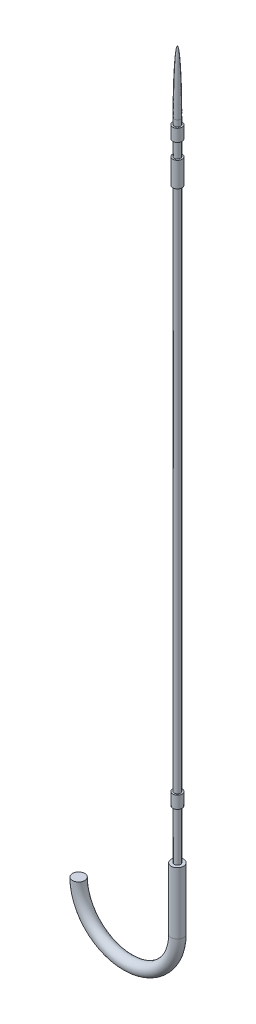
ISO-10303-21;
HEADER;
FILE_DESCRIPTION(('STEP AP214'),'2;1');
FILE_NAME('part.step','',(''),(''),'','','');
FILE_SCHEMA(('AUTOMOTIVE_DESIGN { 1 0 10303 214 1 1 1 1 }'));
ENDSEC;
DATA;
#1=APPLICATION_CONTEXT('core data for automotive mechanical design processes');
#2=APPLICATION_PROTOCOL_DEFINITION('international standard','automotive_design',2000,#1);
#3=PRODUCT_CONTEXT('',#1,'mechanical');
#4=PRODUCT('Part','Part','',(#3));
#5=PRODUCT_RELATED_PRODUCT_CATEGORY('part','',(#4));
#6=PRODUCT_DEFINITION_FORMATION('','',#4);
#7=PRODUCT_DEFINITION_CONTEXT('part definition',#1,'design');
#8=PRODUCT_DEFINITION('design','',#6,#7);
#9=PRODUCT_DEFINITION_SHAPE('','',#8);
#10=(LENGTH_UNIT() NAMED_UNIT(*) SI_UNIT(.MILLI.,.METRE.));
#11=(NAMED_UNIT(*) PLANE_ANGLE_UNIT() SI_UNIT($,.RADIAN.));
#12=(NAMED_UNIT(*) SI_UNIT($,.STERADIAN.) SOLID_ANGLE_UNIT());
#13=UNCERTAINTY_MEASURE_WITH_UNIT(LENGTH_MEASURE(1.E-05),#10,'distance_accuracy_value','');
#14=(GEOMETRIC_REPRESENTATION_CONTEXT(3) GLOBAL_UNCERTAINTY_ASSIGNED_CONTEXT((#13)) GLOBAL_UNIT_ASSIGNED_CONTEXT((#10,
#11,#12)) REPRESENTATION_CONTEXT('',''));
#15=CARTESIAN_POINT('',(0.,0.,0.));
#16=DIRECTION('',(0.,0.,1.));
#17=DIRECTION('',(1.,0.,0.));
#18=AXIS2_PLACEMENT_3D('',#15,#16,#17);
#19=CARTESIAN_POINT('',(0.,870.,0.));
#20=DIRECTION('',(0.,-1.,0.));
#21=DIRECTION('',(0.,0.,-1.));
#22=AXIS2_PLACEMENT_3D('',#19,#20,#21);
#23=CYLINDRICAL_SURFACE('',#22,5.);
#24=CARTESIAN_POINT('',(0.,0.,0.));
#25=DIRECTION('',(0.,1.,0.));
#26=DIRECTION('',(0.,0.,1.));
#27=AXIS2_PLACEMENT_3D('',#24,#25,#26);
#28=CIRCLE('',#27,5.);
#29=CARTESIAN_POINT('',(0.,0.,-5.));
#30=VERTEX_POINT('',#29);
#31=EDGE_CURVE('E76',#30,#30,#28,.T.);
#32=CARTESIAN_POINT('',(0.,850.,0.));
#33=DIRECTION('',(0.,1.,0.));
#34=DIRECTION('',(0.,0.,1.));
#35=AXIS2_PLACEMENT_3D('',#32,#33,#34);
#36=CIRCLE('',#35,5.);
#37=CARTESIAN_POINT('',(0.,850.,-5.));
#38=VERTEX_POINT('',#37);
#39=EDGE_CURVE('E75',#38,#38,#36,.T.);
#40=CARTESIAN_POINT('',(0.,0.,-5.));
#41=CARTESIAN_POINT('',(0.,8.85416666666669,-5.));
#42=CARTESIAN_POINT('',(0.,17.7083333333334,-5.));
#43=CARTESIAN_POINT('',(0.,35.4166666666667,-5.));
#44=CARTESIAN_POINT('',(0.,44.2708333333333,-5.));
#45=CARTESIAN_POINT('',(0.,61.9791666666667,-5.));
#46=CARTESIAN_POINT('',(0.,70.8333333333333,-5.));
#47=CARTESIAN_POINT('',(0.,88.5416666666667,-5.));
#48=CARTESIAN_POINT('',(0.,97.3958333333333,-5.));
#49=CARTESIAN_POINT('',(0.,115.104166666667,-5.));
#50=CARTESIAN_POINT('',(0.,123.958333333333,-5.));
#51=CARTESIAN_POINT('',(0.,141.666666666667,-5.));
#52=CARTESIAN_POINT('',(0.,150.520833333333,-5.));
#53=CARTESIAN_POINT('',(0.,168.229166666667,-5.));
#54=CARTESIAN_POINT('',(0.,177.083333333333,-5.));
#55=CARTESIAN_POINT('',(0.,194.791666666667,-5.));
#56=CARTESIAN_POINT('',(0.,203.645833333333,-5.));
#57=CARTESIAN_POINT('',(0.,221.354166666667,-5.));
#58=CARTESIAN_POINT('',(0.,230.208333333333,-5.));
#59=CARTESIAN_POINT('',(0.,247.916666666667,-5.));
#60=CARTESIAN_POINT('',(0.,256.770833333333,-5.));
#61=CARTESIAN_POINT('',(0.,274.479166666667,-5.));
#62=CARTESIAN_POINT('',(0.,283.333333333333,-5.));
#63=CARTESIAN_POINT('',(0.,301.041666666667,-5.));
#64=CARTESIAN_POINT('',(0.,309.895833333333,-5.));
#65=CARTESIAN_POINT('',(0.,327.604166666667,-5.));
#66=CARTESIAN_POINT('',(0.,336.458333333333,-5.));
#67=CARTESIAN_POINT('',(0.,354.166666666667,-5.));
#68=CARTESIAN_POINT('',(0.,363.020833333333,-5.));
#69=CARTESIAN_POINT('',(0.,380.729166666667,-5.));
#70=CARTESIAN_POINT('',(0.,389.583333333333,-5.));
#71=CARTESIAN_POINT('',(0.,407.291666666667,-5.));
#72=CARTESIAN_POINT('',(0.,416.145833333333,-5.));
#73=CARTESIAN_POINT('',(0.,433.854166666667,-5.));
#74=CARTESIAN_POINT('',(0.,442.708333333333,-5.));
#75=CARTESIAN_POINT('',(0.,460.416666666667,-5.));
#76=CARTESIAN_POINT('',(0.,469.270833333333,-5.));
#77=CARTESIAN_POINT('',(0.,486.979166666667,-5.));
#78=CARTESIAN_POINT('',(0.,495.833333333333,-5.));
#79=CARTESIAN_POINT('',(0.,513.541666666667,-5.));
#80=CARTESIAN_POINT('',(0.,522.395833333333,-5.));
#81=CARTESIAN_POINT('',(0.,540.104166666667,-5.));
#82=CARTESIAN_POINT('',(0.,548.958333333333,-5.));
#83=CARTESIAN_POINT('',(0.,566.666666666667,-5.));
#84=CARTESIAN_POINT('',(0.,575.520833333333,-5.));
#85=CARTESIAN_POINT('',(0.,593.229166666667,-5.));
#86=CARTESIAN_POINT('',(0.,602.083333333333,-5.));
#87=CARTESIAN_POINT('',(0.,619.791666666667,-5.));
#88=CARTESIAN_POINT('',(0.,628.645833333333,-5.));
#89=CARTESIAN_POINT('',(0.,646.354166666667,-5.));
#90=CARTESIAN_POINT('',(0.,655.208333333333,-5.));
#91=CARTESIAN_POINT('',(0.,672.916666666667,-5.));
#92=CARTESIAN_POINT('',(0.,681.770833333333,-5.));
#93=CARTESIAN_POINT('',(0.,699.479166666667,-5.));
#94=CARTESIAN_POINT('',(0.,708.333333333333,-5.));
#95=CARTESIAN_POINT('',(0.,726.041666666667,-5.));
#96=CARTESIAN_POINT('',(0.,734.895833333333,-5.));
#97=CARTESIAN_POINT('',(0.,752.604166666667,-5.));
#98=CARTESIAN_POINT('',(0.,761.458333333333,-5.));
#99=CARTESIAN_POINT('',(0.,779.166666666667,-5.));
#100=CARTESIAN_POINT('',(0.,788.020833333333,-5.));
#101=CARTESIAN_POINT('',(0.,805.729166666667,-5.));
#102=CARTESIAN_POINT('',(0.,814.583333333333,-5.));
#103=CARTESIAN_POINT('',(0.,832.291666666667,-5.));
#104=CARTESIAN_POINT('',(0.,841.145833333333,-5.));
#105=CARTESIAN_POINT('',(0.,850.,-5.));
#106=B_SPLINE_CURVE_WITH_KNOTS('',3,(#40,#41,#42,#43,#44,#45,#46,#47,#48,#49,#50,#51,#52,#53,
#54,#55,#56,#57,#58,#59,#60,#61,#62,#63,#64,#65,#66,#67,#68,#69,#70,#71,#72,#73,#74,#75,#76,#77,
#78,#79,#80,#81,#82,#83,#84,#85,#86,#87,#88,#89,#90,#91,#92,#93,#94,#95,#96,#97,#98,#99,#100,
#101,#102,#103,#104,#105),.UNSPECIFIED.,.F.,.F.,(4,2,2,2,2,2,2,2,2,2,2,2,2,2,2,2,2,2,2,2,2,2,2,
2,2,2,2,2,2,2,2,2,4),(0.,26.5625,53.125,79.6875,106.25,132.8125,159.375,185.9375,212.5,239.0625,
265.625,292.1875,318.75,345.3125,371.875,398.4375,425.,451.5625,478.125,504.6875,531.25,
557.8125,584.375,610.9375,637.5,664.0625,690.625,717.1875,743.75,770.3125,796.875,823.4375,
850.),.UNSPECIFIED.);
#107=EDGE_CURVE('BSEAM36',#30,#38,#106,.T.);
#108=ORIENTED_EDGE('',*,*,#31,.T.);
#109=ORIENTED_EDGE('',*,*,#39,.F.);
#110=ORIENTED_EDGE('',*,*,#107,.T.);
#111=ORIENTED_EDGE('',*,*,#107,.F.);
#112=EDGE_LOOP('',(#108,#110,#109,#111));
#113=FACE_BOUND('',#112,.T.);
#114=ADVANCED_FACE('F36',(#113),#23,.T.);
#115=CARTESIAN_POINT('',(0.,-20.,0.));
#116=DIRECTION('',(0.,1.,0.));
#117=DIRECTION('',(0.,0.,1.));
#118=AXIS2_PLACEMENT_3D('',#115,#116,#117);
#119=CYLINDRICAL_SURFACE('',#118,7.5);
#120=CARTESIAN_POINT('',(0.,-20.,0.));
#121=DIRECTION('',(0.,-1.,0.));
#122=DIRECTION('',(0.,0.,-1.));
#123=AXIS2_PLACEMENT_3D('',#120,#121,#122);
#124=CIRCLE('',#123,7.5);
#125=CARTESIAN_POINT('',(0.,-20.,-7.5));
#126=VERTEX_POINT('',#125);
#127=EDGE_CURVE('E77',#126,#126,#124,.T.);
#128=ORIENTED_EDGE('',*,*,#127,.F.);
#129=EDGE_LOOP('',(#128));
#130=FACE_BOUND('',#129,.T.);
#131=CARTESIAN_POINT('',(0.,0.,0.));
#132=DIRECTION('',(0.,-1.,0.));
#133=DIRECTION('',(0.,0.,-1.));
#134=AXIS2_PLACEMENT_3D('',#131,#132,#133);
#135=CIRCLE('',#134,7.5);
#136=CARTESIAN_POINT('',(0.,0.,-7.5));
#137=VERTEX_POINT('',#136);
#138=EDGE_CURVE('E66',#137,#137,#135,.T.);
#139=ORIENTED_EDGE('',*,*,#138,.T.);
#140=EDGE_LOOP('',(#139));
#141=FACE_BOUND('',#140,.T.);
#142=ADVANCED_FACE('F126',(#130,#141),#119,.T.);
#143=CARTESIAN_POINT('',(0.,-20.,0.));
#144=DIRECTION('',(0.,-1.,0.));
#145=DIRECTION('',(0.,0.,-1.));
#146=AXIS2_PLACEMENT_3D('',#143,#144,#145);
#147=PLANE('',#146);
#148=CARTESIAN_POINT('',(0.,-20.,0.));
#149=DIRECTION('',(0.,-1.,0.));
#150=DIRECTION('',(0.,0.,-1.));
#151=AXIS2_PLACEMENT_3D('',#148,#149,#150);
#152=CIRCLE('',#151,5.);
#153=CARTESIAN_POINT('',(0.,-20.,-5.));
#154=VERTEX_POINT('',#153);
#155=EDGE_CURVE('E72',#154,#154,#152,.T.);
#156=ORIENTED_EDGE('',*,*,#155,.F.);
#157=EDGE_LOOP('',(#156));
#158=FACE_BOUND('',#157,.T.);
#159=ORIENTED_EDGE('',*,*,#127,.T.);
#160=EDGE_LOOP('',(#159));
#161=FACE_BOUND('',#160,.T.);
#162=ADVANCED_FACE('F131',(#158,#161),#147,.T.);
#163=CARTESIAN_POINT('',(0.,0.,0.));
#164=DIRECTION('',(0.,-1.,0.));
#165=DIRECTION('',(0.,0.,-1.));
#166=AXIS2_PLACEMENT_3D('',#163,#164,#165);
#167=PLANE('',#166);
#168=ORIENTED_EDGE('',*,*,#31,.F.);
#169=EDGE_LOOP('',(#168));
#170=FACE_BOUND('',#169,.T.);
#171=ORIENTED_EDGE('',*,*,#138,.F.);
#172=EDGE_LOOP('',(#171));
#173=FACE_BOUND('',#172,.T.);
#174=ADVANCED_FACE('F136',(#170,#173),#167,.F.);
#175=CARTESIAN_POINT('',(0.,-100.,0.));
#176=DIRECTION('',(0.,1.,0.));
#177=DIRECTION('',(0.,0.,1.));
#178=AXIS2_PLACEMENT_3D('',#175,#176,#177);
#179=CYLINDRICAL_SURFACE('',#178,5.);
#180=CARTESIAN_POINT('',(0.,-100.,0.));
#181=DIRECTION('',(0.,-1.,0.));
#182=DIRECTION('',(0.,0.,-1.));
#183=AXIS2_PLACEMENT_3D('',#180,#181,#182);
#184=CIRCLE('',#183,5.);
#185=CARTESIAN_POINT('',(0.,-100.,-5.));
#186=VERTEX_POINT('',#185);
#187=EDGE_CURVE('E62',#186,#186,#184,.T.);
#188=ORIENTED_EDGE('',*,*,#187,.F.);
#189=EDGE_LOOP('',(#188));
#190=FACE_BOUND('',#189,.T.);
#191=ORIENTED_EDGE('',*,*,#155,.T.);
#192=EDGE_LOOP('',(#191));
#193=FACE_BOUND('',#192,.T.);
#194=ADVANCED_FACE('F120',(#190,#193),#179,.T.);
#195=CARTESIAN_POINT('',(0.,-100.,0.));
#196=DIRECTION('',(0.,-1.,0.));
#197=DIRECTION('',(0.,0.,-1.));
#198=AXIS2_PLACEMENT_3D('',#195,#196,#197);
#199=PLANE('',#198);
#200=ORIENTED_EDGE('',*,*,#187,.T.);
#201=EDGE_LOOP('',(#200));
#202=FACE_BOUND('',#201,.T.);
#203=CARTESIAN_POINT('',(0.,-100.,0.));
#204=DIRECTION('',(0.,-1.,0.));
#205=DIRECTION('',(0.,0.,-1.));
#206=AXIS2_PLACEMENT_3D('',#203,#204,#205);
#207=CIRCLE('',#206,10.);
#208=CARTESIAN_POINT('',(0.,-100.,-10.));
#209=VERTEX_POINT('',#208);
#210=EDGE_CURVE('E54',#209,#209,#207,.T.);
#211=ORIENTED_EDGE('',*,*,#210,.F.);
#212=EDGE_LOOP('',(#211));
#213=FACE_BOUND('',#212,.T.);
#214=ADVANCED_FACE('F121',(#202,#213),#199,.F.);
#215=CARTESIAN_POINT('',(-160.,-200.,0.));
#216=DIRECTION('',(0.,1.,0.));
#217=DIRECTION('',(0.,0.,-1.));
#218=AXIS2_PLACEMENT_3D('',#215,#216,#217);
#219=PLANE('',#218);
#220=CARTESIAN_POINT('',(-160.,-200.,0.));
#221=DIRECTION('',(0.,1.,0.));
#222=DIRECTION('',(0.,0.,-1.));
#223=AXIS2_PLACEMENT_3D('',#220,#221,#222);
#224=CIRCLE('',#223,10.);
#225=CARTESIAN_POINT('',(-160.,-200.,-10.));
#226=VERTEX_POINT('',#225);
#227=EDGE_CURVE('E59',#226,#226,#224,.T.);
#228=ORIENTED_EDGE('',*,*,#227,.T.);
#229=EDGE_LOOP('',(#228));
#230=FACE_BOUND('',#229,.T.);
#231=ADVANCED_FACE('F60',(#230),#219,.T.);
#232=CARTESIAN_POINT('',(0.,-100.,0.));
#233=DIRECTION('',(0.,-1.,0.));
#234=DIRECTION('',(1.,0.,0.));
#235=AXIS2_PLACEMENT_3D('',#232,#233,#234);
#236=CYLINDRICAL_SURFACE('',#235,10.);
#237=CARTESIAN_POINT('',(0.,-200.,0.));
#238=DIRECTION('',(0.,-1.,0.));
#239=DIRECTION('',(0.,0.,-1.));
#240=AXIS2_PLACEMENT_3D('',#237,#238,#239);
#241=CIRCLE('',#240,10.);
#242=CARTESIAN_POINT('',(0.,-200.,-10.));
#243=VERTEX_POINT('',#242);
#244=EDGE_CURVE('E63',#243,#243,#241,.T.);
#245=ORIENTED_EDGE('',*,*,#244,.F.);
#246=EDGE_LOOP('',(#245));
#247=FACE_BOUND('',#246,.T.);
#248=ORIENTED_EDGE('',*,*,#210,.T.);
#249=EDGE_LOOP('',(#248));
#250=FACE_BOUND('',#249,.T.);
#251=ADVANCED_FACE('F109',(#247,#250),#236,.T.);
#252=CARTESIAN_POINT('',(-80.,-200.,0.));
#253=DIRECTION('',(0.,0.,-1.));
#254=DIRECTION('',(-1.,0.,0.));
#255=AXIS2_PLACEMENT_3D('',#252,#253,#254);
#256=TOROIDAL_SURFACE('',#255,80.,10.);
#257=ORIENTED_EDGE('',*,*,#227,.F.);
#258=EDGE_LOOP('',(#257));
#259=FACE_BOUND('',#258,.T.);
#260=ORIENTED_EDGE('',*,*,#244,.T.);
#261=EDGE_LOOP('',(#260));
#262=FACE_BOUND('',#261,.T.);
#263=ADVANCED_FACE('F111',(#259,#262),#256,.T.);
#264=CARTESIAN_POINT('',(0.,850.,0.));
#265=DIRECTION('',(0.,1.,0.));
#266=DIRECTION('',(0.,0.,1.));
#267=AXIS2_PLACEMENT_3D('',#264,#265,#266);
#268=CYLINDRICAL_SURFACE('',#267,7.5);
#269=CARTESIAN_POINT('',(0.,850.,0.));
#270=DIRECTION('',(0.,1.,0.));
#271=DIRECTION('',(0.,0.,1.));
#272=AXIS2_PLACEMENT_3D('',#269,#270,#271);
#273=CIRCLE('',#272,7.5);
#274=CARTESIAN_POINT('',(0.,850.,7.5));
#275=VERTEX_POINT('',#274);
#276=EDGE_CURVE('E106',#275,#275,#273,.T.);
#277=ORIENTED_EDGE('',*,*,#276,.T.);
#278=EDGE_LOOP('',(#277));
#279=FACE_BOUND('',#278,.T.);
#280=CARTESIAN_POINT('',(0.,890.,0.));
#281=DIRECTION('',(0.,1.,0.));
#282=DIRECTION('',(0.,0.,1.));
#283=AXIS2_PLACEMENT_3D('',#280,#281,#282);
#284=CIRCLE('',#283,7.5);
#285=CARTESIAN_POINT('',(0.,890.,7.5));
#286=VERTEX_POINT('',#285);
#287=EDGE_CURVE('E101',#286,#286,#284,.T.);
#288=ORIENTED_EDGE('',*,*,#287,.F.);
#289=EDGE_LOOP('',(#288));
#290=FACE_BOUND('',#289,.T.);
#291=ADVANCED_FACE('F118',(#279,#290),#268,.T.);
#292=CARTESIAN_POINT('',(0.,850.,0.));
#293=DIRECTION('',(0.,1.,0.));
#294=DIRECTION('',(0.,0.,1.));
#295=AXIS2_PLACEMENT_3D('',#292,#293,#294);
#296=PLANE('',#295);
#297=ORIENTED_EDGE('',*,*,#39,.T.);
#298=EDGE_LOOP('',(#297));
#299=FACE_BOUND('',#298,.T.);
#300=ORIENTED_EDGE('',*,*,#276,.F.);
#301=EDGE_LOOP('',(#300));
#302=FACE_BOUND('',#301,.T.);
#303=ADVANCED_FACE('F151',(#299,#302),#296,.F.);
#304=CARTESIAN_POINT('',(0.,890.,0.));
#305=DIRECTION('',(0.,1.,0.));
#306=DIRECTION('',(0.,0.,1.));
#307=AXIS2_PLACEMENT_3D('',#304,#305,#306);
#308=PLANE('',#307);
#309=CARTESIAN_POINT('',(0.,890.,0.));
#310=DIRECTION('',(0.,1.,0.));
#311=DIRECTION('',(0.,0.,1.));
#312=AXIS2_PLACEMENT_3D('',#309,#310,#311);
#313=CIRCLE('',#312,5.);
#314=CARTESIAN_POINT('',(0.,890.,5.));
#315=VERTEX_POINT('',#314);
#316=EDGE_CURVE('E45',#315,#315,#313,.T.);
#317=ORIENTED_EDGE('',*,*,#316,.F.);
#318=EDGE_LOOP('',(#317));
#319=FACE_BOUND('',#318,.T.);
#320=ORIENTED_EDGE('',*,*,#287,.T.);
#321=EDGE_LOOP('',(#320));
#322=FACE_BOUND('',#321,.T.);
#323=ADVANCED_FACE('F156',(#319,#322),#308,.T.);
#324=CARTESIAN_POINT('',(0.,915.,0.));
#325=DIRECTION('',(0.,-1.,0.));
#326=DIRECTION('',(0.,0.,-1.));
#327=AXIS2_PLACEMENT_3D('',#324,#325,#326);
#328=CYLINDRICAL_SURFACE('',#327,5.);
#329=CARTESIAN_POINT('',(0.,915.,0.));
#330=DIRECTION('',(0.,1.,0.));
#331=DIRECTION('',(0.,0.,1.));
#332=AXIS2_PLACEMENT_3D('',#329,#330,#331);
#333=CIRCLE('',#332,5.);
#334=CARTESIAN_POINT('',(0.,915.,5.));
#335=VERTEX_POINT('',#334);
#336=EDGE_CURVE('E96',#335,#335,#333,.T.);
#337=ORIENTED_EDGE('',*,*,#336,.F.);
#338=EDGE_LOOP('',(#337));
#339=FACE_BOUND('',#338,.T.);
#340=ORIENTED_EDGE('',*,*,#316,.T.);
#341=EDGE_LOOP('',(#340));
#342=FACE_BOUND('',#341,.T.);
#343=ADVANCED_FACE('F163',(#339,#342),#328,.T.);
#344=CARTESIAN_POINT('',(0.,935.,0.));
#345=DIRECTION('',(0.,-1.,0.));
#346=DIRECTION('',(0.,0.,-1.));
#347=AXIS2_PLACEMENT_3D('',#344,#345,#346);
#348=CYLINDRICAL_SURFACE('',#347,7.5);
#349=CARTESIAN_POINT('',(0.,935.,0.));
#350=DIRECTION('',(0.,1.,0.));
#351=DIRECTION('',(0.,0.,1.));
#352=AXIS2_PLACEMENT_3D('',#349,#350,#351);
#353=CIRCLE('',#352,7.5);
#354=CARTESIAN_POINT('',(0.,935.,7.5));
#355=VERTEX_POINT('',#354);
#356=EDGE_CURVE('E91',#355,#355,#353,.T.);
#357=ORIENTED_EDGE('',*,*,#356,.F.);
#358=EDGE_LOOP('',(#357));
#359=FACE_BOUND('',#358,.T.);
#360=CARTESIAN_POINT('',(0.,915.,0.));
#361=DIRECTION('',(0.,1.,0.));
#362=DIRECTION('',(0.,0.,1.));
#363=AXIS2_PLACEMENT_3D('',#360,#361,#362);
#364=CIRCLE('',#363,7.5);
#365=CARTESIAN_POINT('',(0.,915.,7.5));
#366=VERTEX_POINT('',#365);
#367=EDGE_CURVE('E87',#366,#366,#364,.T.);
#368=ORIENTED_EDGE('',*,*,#367,.T.);
#369=EDGE_LOOP('',(#368));
#370=FACE_BOUND('',#369,.T.);
#371=ADVANCED_FACE('F167',(#359,#370),#348,.T.);
#372=CARTESIAN_POINT('',(0.,935.,0.));
#373=DIRECTION('',(0.,1.,0.));
#374=DIRECTION('',(0.,0.,1.));
#375=AXIS2_PLACEMENT_3D('',#372,#373,#374);
#376=PLANE('',#375);
#377=CARTESIAN_POINT('',(0.,935.,0.));
#378=DIRECTION('',(0.,1.,0.));
#379=DIRECTION('',(0.,0.,1.));
#380=AXIS2_PLACEMENT_3D('',#377,#378,#379);
#381=CIRCLE('',#380,5.);
#382=CARTESIAN_POINT('',(0.,935.,5.));
#383=VERTEX_POINT('',#382);
#384=EDGE_CURVE('E11',#383,#383,#381,.T.);
#385=ORIENTED_EDGE('',*,*,#384,.F.);
#386=EDGE_LOOP('',(#385));
#387=FACE_BOUND('',#386,.T.);
#388=ORIENTED_EDGE('',*,*,#356,.T.);
#389=EDGE_LOOP('',(#388));
#390=FACE_BOUND('',#389,.T.);
#391=ADVANCED_FACE('F171',(#387,#390),#376,.T.);
#392=CARTESIAN_POINT('',(0.,915.,0.));
#393=DIRECTION('',(0.,1.,0.));
#394=DIRECTION('',(0.,0.,1.));
#395=AXIS2_PLACEMENT_3D('',#392,#393,#394);
#396=PLANE('',#395);
#397=ORIENTED_EDGE('',*,*,#336,.T.);
#398=EDGE_LOOP('',(#397));
#399=FACE_BOUND('',#398,.T.);
#400=ORIENTED_EDGE('',*,*,#367,.F.);
#401=EDGE_LOOP('',(#400));
#402=FACE_BOUND('',#401,.T.);
#403=ADVANCED_FACE('F173',(#399,#402),#396,.F.);
#404=CARTESIAN_POINT('',(0.,945.,0.));
#405=DIRECTION('',(0.,-1.,0.));
#406=DIRECTION('',(0.,0.,-1.));
#407=AXIS2_PLACEMENT_3D('',#404,#405,#406);
#408=CYLINDRICAL_SURFACE('',#407,5.);
#409=CARTESIAN_POINT('',(0.,945.,0.));
#410=DIRECTION('',(0.,1.,0.));
#411=DIRECTION('',(0.,0.,1.));
#412=AXIS2_PLACEMENT_3D('',#409,#410,#411);
#413=CIRCLE('',#412,5.);
#414=CARTESIAN_POINT('',(0.,945.,5.));
#415=VERTEX_POINT('',#414);
#416=EDGE_CURVE('E85',#415,#415,#413,.T.);
#417=ORIENTED_EDGE('',*,*,#416,.F.);
#418=EDGE_LOOP('',(#417));
#419=FACE_BOUND('',#418,.T.);
#420=ORIENTED_EDGE('',*,*,#384,.T.);
#421=EDGE_LOOP('',(#420));
#422=FACE_BOUND('',#421,.T.);
#423=ADVANCED_FACE('F176',(#419,#422),#408,.T.);
#424=CARTESIAN_POINT('',(0.,945.,0.));
#425=DIRECTION('',(1.,0.,0.));
#426=DIRECTION('',(0.,1.,0.));
#427=AXIS2_PLACEMENT_3D('',#424,#425,#426);
#428=ELLIPSE('',#427,100.,5.);
#429=TRIMMED_CURVE('',#428,(PARAMETER_VALUE(0.)),(PARAMETER_VALUE(3.14159265358979)),.T.,.PARAMETER.);
#430=CARTESIAN_POINT('',(0.,845.,0.));
#431=DIRECTION('',(0.,1.,0.));
#432=AXIS1_PLACEMENT('',#430,#431);
#433=SURFACE_OF_REVOLUTION('',#429,#432);
#434=CARTESIAN_POINT('',(0.,1045.,0.));
#435=VERTEX_POINT('',#434);
#436=VERTEX_LOOP('',#435);
#437=FACE_BOUND('',#436,.T.);
#438=ORIENTED_EDGE('',*,*,#416,.T.);
#439=EDGE_LOOP('',(#438));
#440=FACE_BOUND('',#439,.T.);
#441=ADVANCED_FACE('F38',(#437,#440),#433,.F.);
#442=CLOSED_SHELL('',(#114,#142,#162,#174,#194,#214,#231,#251,#263,#291,#303,#323,#343,#371,
#391,#403,#423,#441));
#443=MANIFOLD_SOLID_BREP('B2',#442);
#444=ADVANCED_BREP_SHAPE_REPRESENTATION('',(#18,#443),#14);
#445=SHAPE_DEFINITION_REPRESENTATION(#9,#444);
ENDSEC;
END-ISO-10303-21;
